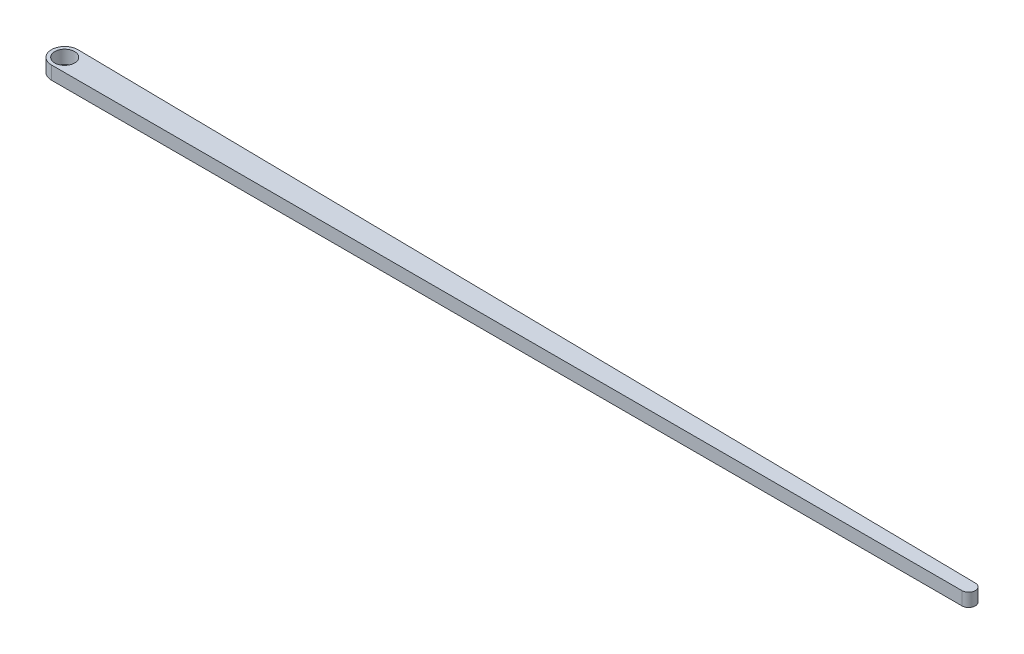
ISO-10303-21;
HEADER;
FILE_DESCRIPTION(('STEP AP214'),'2;1');
FILE_NAME('part.step','',(''),(''),'','','');
FILE_SCHEMA(('AUTOMOTIVE_DESIGN { 1 0 10303 214 1 1 1 1 }'));
ENDSEC;
DATA;
#1=APPLICATION_CONTEXT('core data for automotive mechanical design processes');
#2=APPLICATION_PROTOCOL_DEFINITION('international standard','automotive_design',2000,#1);
#3=PRODUCT_CONTEXT('',#1,'mechanical');
#4=PRODUCT('Part','Part','',(#3));
#5=PRODUCT_RELATED_PRODUCT_CATEGORY('part','',(#4));
#6=PRODUCT_DEFINITION_FORMATION('','',#4);
#7=PRODUCT_DEFINITION_CONTEXT('part definition',#1,'design');
#8=PRODUCT_DEFINITION('design','',#6,#7);
#9=PRODUCT_DEFINITION_SHAPE('','',#8);
#10=(LENGTH_UNIT() NAMED_UNIT(*) SI_UNIT(.MILLI.,.METRE.));
#11=(NAMED_UNIT(*) PLANE_ANGLE_UNIT() SI_UNIT($,.RADIAN.));
#12=(NAMED_UNIT(*) SI_UNIT($,.STERADIAN.) SOLID_ANGLE_UNIT());
#13=UNCERTAINTY_MEASURE_WITH_UNIT(LENGTH_MEASURE(1.E-05),#10,'distance_accuracy_value','');
#14=(GEOMETRIC_REPRESENTATION_CONTEXT(3) GLOBAL_UNCERTAINTY_ASSIGNED_CONTEXT((#13)) GLOBAL_UNIT_ASSIGNED_CONTEXT((#10,
#11,#12)) REPRESENTATION_CONTEXT('',''));
#15=CARTESIAN_POINT('',(0.,0.,0.));
#16=DIRECTION('',(0.,0.,1.));
#17=DIRECTION('',(1.,0.,0.));
#18=AXIS2_PLACEMENT_3D('',#15,#16,#17);
#19=CARTESIAN_POINT('',(0.930712179902434,32.,-63.9864623682923));
#20=DIRECTION('',(0.0145439160968555,0.,-0.999894231658813));
#21=DIRECTION('',(-0.999894231658813,0.,-0.0145439160968555));
#22=AXIS2_PLACEMENT_3D('',#19,#20,#21);
#23=PLANE('',#22);
#24=DIRECTION('',(0.999894231658813,0.,0.0145439160968555));
#25=VECTOR('',#24,1.);
#26=CARTESIAN_POINT('',(0.930712179902434,0.,-63.9864623682923));
#27=LINE('',#26,#25);
#28=CARTESIAN_POINT('',(0.,0.,-64.));
#29=VERTEX_POINT('',#28);
#30=CARTESIAN_POINT('',(2200.,0.,-32.));
#31=VERTEX_POINT('',#30);
#32=EDGE_CURVE('E105',#29,#31,#27,.T.);
#33=ORIENTED_EDGE('',*,*,#32,.F.);
#34=DIRECTION('',(0.,-1.,0.));
#35=VECTOR('',#34,1.);
#36=CARTESIAN_POINT('',(0.,32.,-64.));
#37=LINE('',#36,#35);
#38=CARTESIAN_POINT('',(0.,32.,-64.));
#39=VERTEX_POINT('',#38);
#40=EDGE_CURVE('E11',#39,#29,#37,.T.);
#41=ORIENTED_EDGE('',*,*,#40,.F.);
#42=DIRECTION('',(0.999894231658813,0.,0.0145439160968555));
#43=VECTOR('',#42,1.);
#44=CARTESIAN_POINT('',(0.930712179902434,32.,-63.9864623682923));
#45=LINE('',#44,#43);
#46=CARTESIAN_POINT('',(2200.,32.,-32.));
#47=VERTEX_POINT('',#46);
#48=EDGE_CURVE('E90',#39,#47,#45,.T.);
#49=ORIENTED_EDGE('',*,*,#48,.T.);
#50=DIRECTION('',(0.,-1.,0.));
#51=VECTOR('',#50,1.);
#52=CARTESIAN_POINT('',(2200.,32.,-32.));
#53=LINE('',#52,#51);
#54=EDGE_CURVE('E78',#47,#31,#53,.T.);
#55=ORIENTED_EDGE('',*,*,#54,.T.);
#56=EDGE_LOOP('',(#33,#41,#49,#55));
#57=FACE_BOUND('',#56,.T.);
#58=ADVANCED_FACE('F39',(#57),#23,.T.);
#59=CARTESIAN_POINT('',(0.,32.,-32.));
#60=DIRECTION('',(0.,-1.,0.));
#61=DIRECTION('',(0.,0.,-1.));
#62=AXIS2_PLACEMENT_3D('',#59,#60,#61);
#63=CYLINDRICAL_SURFACE('',#62,32.);
#64=CARTESIAN_POINT('',(0.,0.,-32.));
#65=DIRECTION('',(0.,1.,0.));
#66=DIRECTION('',(0.,0.,1.));
#67=AXIS2_PLACEMENT_3D('',#64,#65,#66);
#68=CIRCLE('',#67,32.);
#69=CARTESIAN_POINT('',(0.,0.,0.));
#70=VERTEX_POINT('',#69);
#71=EDGE_CURVE('E95',#29,#70,#68,.T.);
#72=ORIENTED_EDGE('',*,*,#71,.T.);
#73=DIRECTION('',(0.,-1.,0.));
#74=VECTOR('',#73,1.);
#75=CARTESIAN_POINT('',(0.,32.,0.));
#76=LINE('',#75,#74);
#77=CARTESIAN_POINT('',(0.,32.,0.));
#78=VERTEX_POINT('',#77);
#79=EDGE_CURVE('E47',#78,#70,#76,.T.);
#80=ORIENTED_EDGE('',*,*,#79,.F.);
#81=CARTESIAN_POINT('',(0.,32.,-32.));
#82=DIRECTION('',(0.,1.,0.));
#83=DIRECTION('',(0.,0.,1.));
#84=AXIS2_PLACEMENT_3D('',#81,#82,#83);
#85=CIRCLE('',#84,32.);
#86=EDGE_CURVE('E84',#39,#78,#85,.T.);
#87=ORIENTED_EDGE('',*,*,#86,.F.);
#88=ORIENTED_EDGE('',*,*,#40,.T.);
#89=EDGE_LOOP('',(#72,#80,#87,#88));
#90=FACE_BOUND('',#89,.T.);
#91=ADVANCED_FACE('F93',(#90),#63,.T.);
#92=CARTESIAN_POINT('',(0.,32.,0.));
#93=DIRECTION('',(0.,0.,-1.));
#94=DIRECTION('',(-1.,0.,0.));
#95=AXIS2_PLACEMENT_3D('',#92,#93,#94);
#96=PLANE('',#95);
#97=DIRECTION('',(1.,0.,0.));
#98=VECTOR('',#97,1.);
#99=CARTESIAN_POINT('',(0.,0.,0.));
#100=LINE('',#99,#98);
#101=CARTESIAN_POINT('',(2200.,0.,0.));
#102=VERTEX_POINT('',#101);
#103=EDGE_CURVE('E71',#70,#102,#100,.T.);
#104=ORIENTED_EDGE('',*,*,#103,.T.);
#105=DIRECTION('',(0.,-1.,0.));
#106=VECTOR('',#105,1.);
#107=CARTESIAN_POINT('',(2200.,32.,0.));
#108=LINE('',#107,#106);
#109=CARTESIAN_POINT('',(2200.,32.,0.));
#110=VERTEX_POINT('',#109);
#111=EDGE_CURVE('E96',#110,#102,#108,.T.);
#112=ORIENTED_EDGE('',*,*,#111,.F.);
#113=DIRECTION('',(1.,0.,0.));
#114=VECTOR('',#113,1.);
#115=CARTESIAN_POINT('',(0.,32.,0.));
#116=LINE('',#115,#114);
#117=EDGE_CURVE('E89',#78,#110,#116,.T.);
#118=ORIENTED_EDGE('',*,*,#117,.F.);
#119=ORIENTED_EDGE('',*,*,#79,.T.);
#120=EDGE_LOOP('',(#104,#112,#118,#119));
#121=FACE_BOUND('',#120,.T.);
#122=ADVANCED_FACE('F97',(#121),#96,.F.);
#123=CARTESIAN_POINT('',(2200.,32.,-16.));
#124=DIRECTION('',(0.,-1.,0.));
#125=DIRECTION('',(0.,0.,-1.));
#126=AXIS2_PLACEMENT_3D('',#123,#124,#125);
#127=CYLINDRICAL_SURFACE('',#126,16.);
#128=CARTESIAN_POINT('',(2200.,0.,-16.));
#129=DIRECTION('',(0.,1.,0.));
#130=DIRECTION('',(0.,0.,1.));
#131=AXIS2_PLACEMENT_3D('',#128,#129,#130);
#132=CIRCLE('',#131,16.);
#133=EDGE_CURVE('E110',#102,#31,#132,.T.);
#134=ORIENTED_EDGE('',*,*,#133,.T.);
#135=ORIENTED_EDGE('',*,*,#54,.F.);
#136=CARTESIAN_POINT('',(2200.,32.,-16.));
#137=DIRECTION('',(0.,1.,0.));
#138=DIRECTION('',(0.,0.,1.));
#139=AXIS2_PLACEMENT_3D('',#136,#137,#138);
#140=CIRCLE('',#139,16.);
#141=EDGE_CURVE('E55',#110,#47,#140,.T.);
#142=ORIENTED_EDGE('',*,*,#141,.F.);
#143=ORIENTED_EDGE('',*,*,#111,.T.);
#144=EDGE_LOOP('',(#134,#135,#142,#143));
#145=FACE_BOUND('',#144,.T.);
#146=ADVANCED_FACE('F118',(#145),#127,.T.);
#147=CARTESIAN_POINT('',(0.,32.,-32.));
#148=DIRECTION('',(0.,-1.,0.));
#149=DIRECTION('',(0.,0.,-1.));
#150=AXIS2_PLACEMENT_3D('',#147,#148,#149);
#151=CYLINDRICAL_SURFACE('',#150,24.);
#152=CARTESIAN_POINT('',(0.,32.,-32.));
#153=DIRECTION('',(0.,1.,0.));
#154=DIRECTION('',(0.,0.,1.));
#155=AXIS2_PLACEMENT_3D('',#152,#153,#154);
#156=CIRCLE('',#155,24.);
#157=CARTESIAN_POINT('',(0.,32.,-8.));
#158=VERTEX_POINT('',#157);
#159=EDGE_CURVE('E99',#158,#158,#156,.T.);
#160=ORIENTED_EDGE('',*,*,#159,.T.);
#161=EDGE_LOOP('',(#160));
#162=FACE_BOUND('',#161,.T.);
#163=CARTESIAN_POINT('',(0.,0.,-32.));
#164=DIRECTION('',(0.,1.,0.));
#165=DIRECTION('',(0.,0.,1.));
#166=AXIS2_PLACEMENT_3D('',#163,#164,#165);
#167=CIRCLE('',#166,24.);
#168=CARTESIAN_POINT('',(0.,0.,-8.));
#169=VERTEX_POINT('',#168);
#170=EDGE_CURVE('E112',#169,#169,#167,.T.);
#171=ORIENTED_EDGE('',*,*,#170,.F.);
#172=EDGE_LOOP('',(#171));
#173=FACE_BOUND('',#172,.T.);
#174=ADVANCED_FACE('F133',(#162,#173),#151,.F.);
#175=CARTESIAN_POINT('',(0.,32.,0.));
#176=DIRECTION('',(0.,1.,0.));
#177=DIRECTION('',(0.,0.,1.));
#178=AXIS2_PLACEMENT_3D('',#175,#176,#177);
#179=PLANE('',#178);
#180=ORIENTED_EDGE('',*,*,#48,.F.);
#181=ORIENTED_EDGE('',*,*,#86,.T.);
#182=ORIENTED_EDGE('',*,*,#117,.T.);
#183=ORIENTED_EDGE('',*,*,#141,.T.);
#184=EDGE_LOOP('',(#180,#181,#182,#183));
#185=FACE_BOUND('',#184,.T.);
#186=ORIENTED_EDGE('',*,*,#159,.F.);
#187=EDGE_LOOP('',(#186));
#188=FACE_BOUND('',#187,.T.);
#189=ADVANCED_FACE('F86',(#185,#188),#179,.T.);
#190=CARTESIAN_POINT('',(0.,0.,0.));
#191=DIRECTION('',(0.,1.,0.));
#192=DIRECTION('',(0.,0.,1.));
#193=AXIS2_PLACEMENT_3D('',#190,#191,#192);
#194=PLANE('',#193);
#195=ORIENTED_EDGE('',*,*,#32,.T.);
#196=ORIENTED_EDGE('',*,*,#133,.F.);
#197=ORIENTED_EDGE('',*,*,#103,.F.);
#198=ORIENTED_EDGE('',*,*,#71,.F.);
#199=EDGE_LOOP('',(#195,#196,#197,#198));
#200=FACE_BOUND('',#199,.T.);
#201=ORIENTED_EDGE('',*,*,#170,.T.);
#202=EDGE_LOOP('',(#201));
#203=FACE_BOUND('',#202,.T.);
#204=ADVANCED_FACE('F120',(#200,#203),#194,.F.);
#205=CLOSED_SHELL('',(#58,#91,#122,#146,#174,#189,#204));
#206=MANIFOLD_SOLID_BREP('B2',#205);
#207=ADVANCED_BREP_SHAPE_REPRESENTATION('',(#18,#206),#14);
#208=SHAPE_DEFINITION_REPRESENTATION(#9,#207);
ENDSEC;
END-ISO-10303-21;
